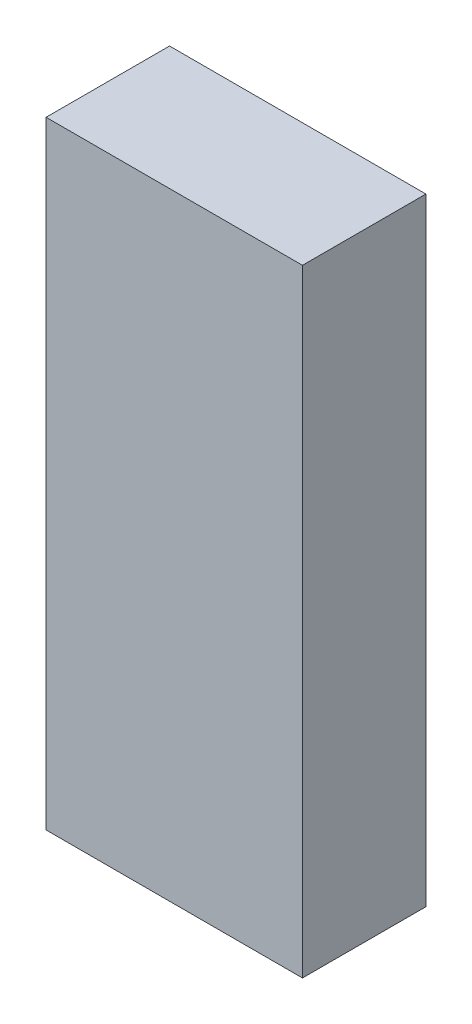
ISO-10303-21;
HEADER;
FILE_DESCRIPTION(('STEP AP214'),'2;1');
FILE_NAME('part.step','',(''),(''),'','','');
FILE_SCHEMA(('AUTOMOTIVE_DESIGN { 1 0 10303 214 1 1 1 1 }'));
ENDSEC;
DATA;
#1=APPLICATION_CONTEXT('core data for automotive mechanical design processes');
#2=APPLICATION_PROTOCOL_DEFINITION('international standard','automotive_design',2000,#1);
#3=PRODUCT_CONTEXT('',#1,'mechanical');
#4=PRODUCT('Part','Part','',(#3));
#5=PRODUCT_RELATED_PRODUCT_CATEGORY('part','',(#4));
#6=PRODUCT_DEFINITION_FORMATION('','',#4);
#7=PRODUCT_DEFINITION_CONTEXT('part definition',#1,'design');
#8=PRODUCT_DEFINITION('design','',#6,#7);
#9=PRODUCT_DEFINITION_SHAPE('','',#8);
#10=(LENGTH_UNIT() NAMED_UNIT(*) SI_UNIT(.MILLI.,.METRE.));
#11=(NAMED_UNIT(*) PLANE_ANGLE_UNIT() SI_UNIT($,.RADIAN.));
#12=(NAMED_UNIT(*) SI_UNIT($,.STERADIAN.) SOLID_ANGLE_UNIT());
#13=UNCERTAINTY_MEASURE_WITH_UNIT(LENGTH_MEASURE(1.E-05),#10,'distance_accuracy_value','');
#14=(GEOMETRIC_REPRESENTATION_CONTEXT(3) GLOBAL_UNCERTAINTY_ASSIGNED_CONTEXT((#13)) GLOBAL_UNIT_ASSIGNED_CONTEXT((#10,
#11,#12)) REPRESENTATION_CONTEXT('',''));
#15=CARTESIAN_POINT('',(0.,0.,0.));
#16=DIRECTION('',(0.,0.,1.));
#17=DIRECTION('',(1.,0.,0.));
#18=AXIS2_PLACEMENT_3D('',#15,#16,#17);
#19=CARTESIAN_POINT('',(0.,0.,13.));
#20=DIRECTION('',(-1.,0.,0.));
#21=DIRECTION('',(0.,0.,1.));
#22=AXIS2_PLACEMENT_3D('',#19,#20,#21);
#23=PLANE('',#22);
#24=DIRECTION('',(0.,1.,0.));
#25=VECTOR('',#24,1.);
#26=CARTESIAN_POINT('',(0.,0.,0.));
#27=LINE('',#26,#25);
#28=CARTESIAN_POINT('',(0.,0.,0.));
#29=VERTEX_POINT('',#28);
#30=CARTESIAN_POINT('',(0.,65.,0.));
#31=VERTEX_POINT('',#30);
#32=EDGE_CURVE('E100',#29,#31,#27,.T.);
#33=ORIENTED_EDGE('',*,*,#32,.T.);
#34=DIRECTION('',(0.,0.,-1.));
#35=VECTOR('',#34,1.);
#36=CARTESIAN_POINT('',(0.,65.,13.));
#37=LINE('',#36,#35);
#38=CARTESIAN_POINT('',(0.,65.,13.));
#39=VERTEX_POINT('',#38);
#40=EDGE_CURVE('E11',#39,#31,#37,.T.);
#41=ORIENTED_EDGE('',*,*,#40,.F.);
#42=DIRECTION('',(0.,1.,0.));
#43=VECTOR('',#42,1.);
#44=CARTESIAN_POINT('',(0.,0.,13.));
#45=LINE('',#44,#43);
#46=CARTESIAN_POINT('',(0.,0.,13.));
#47=VERTEX_POINT('',#46);
#48=EDGE_CURVE('E88',#47,#39,#45,.T.);
#49=ORIENTED_EDGE('',*,*,#48,.F.);
#50=DIRECTION('',(0.,0.,-1.));
#51=VECTOR('',#50,1.);
#52=CARTESIAN_POINT('',(0.,0.,13.));
#53=LINE('',#52,#51);
#54=EDGE_CURVE('E96',#47,#29,#53,.T.);
#55=ORIENTED_EDGE('',*,*,#54,.T.);
#56=EDGE_LOOP('',(#33,#41,#49,#55));
#57=FACE_BOUND('',#56,.T.);
#58=ADVANCED_FACE('F37',(#57),#23,.F.);
#59=CARTESIAN_POINT('',(0.,65.,13.));
#60=DIRECTION('',(0.,-1.,0.));
#61=DIRECTION('',(0.,0.,-1.));
#62=AXIS2_PLACEMENT_3D('',#59,#60,#61);
#63=PLANE('',#62);
#64=DIRECTION('',(-1.,0.,0.));
#65=VECTOR('',#64,1.);
#66=CARTESIAN_POINT('',(0.,65.,0.));
#67=LINE('',#66,#65);
#68=CARTESIAN_POINT('',(-27.,65.,0.));
#69=VERTEX_POINT('',#68);
#70=EDGE_CURVE('E92',#31,#69,#67,.T.);
#71=ORIENTED_EDGE('',*,*,#70,.T.);
#72=DIRECTION('',(0.,0.,-1.));
#73=VECTOR('',#72,1.);
#74=CARTESIAN_POINT('',(-27.,65.,13.));
#75=LINE('',#74,#73);
#76=CARTESIAN_POINT('',(-27.,65.,13.));
#77=VERTEX_POINT('',#76);
#78=EDGE_CURVE('E45',#77,#69,#75,.T.);
#79=ORIENTED_EDGE('',*,*,#78,.F.);
#80=DIRECTION('',(-1.,0.,0.));
#81=VECTOR('',#80,1.);
#82=CARTESIAN_POINT('',(0.,65.,13.));
#83=LINE('',#82,#81);
#84=EDGE_CURVE('E83',#39,#77,#83,.T.);
#85=ORIENTED_EDGE('',*,*,#84,.F.);
#86=ORIENTED_EDGE('',*,*,#40,.T.);
#87=EDGE_LOOP('',(#71,#79,#85,#86));
#88=FACE_BOUND('',#87,.T.);
#89=ADVANCED_FACE('F91',(#88),#63,.F.);
#90=CARTESIAN_POINT('',(-27.,0.,13.));
#91=DIRECTION('',(1.,0.,0.));
#92=DIRECTION('',(0.,0.,-1.));
#93=AXIS2_PLACEMENT_3D('',#90,#91,#92);
#94=PLANE('',#93);
#95=DIRECTION('',(0.,-1.,0.));
#96=VECTOR('',#95,1.);
#97=CARTESIAN_POINT('',(-27.,0.,0.));
#98=LINE('',#97,#96);
#99=CARTESIAN_POINT('',(-27.,0.,0.));
#100=VERTEX_POINT('',#99);
#101=EDGE_CURVE('E70',#69,#100,#98,.T.);
#102=ORIENTED_EDGE('',*,*,#101,.T.);
#103=DIRECTION('',(0.,0.,-1.));
#104=VECTOR('',#103,1.);
#105=CARTESIAN_POINT('',(-27.,0.,13.));
#106=LINE('',#105,#104);
#107=CARTESIAN_POINT('',(-27.,0.,13.));
#108=VERTEX_POINT('',#107);
#109=EDGE_CURVE('E93',#108,#100,#106,.T.);
#110=ORIENTED_EDGE('',*,*,#109,.F.);
#111=DIRECTION('',(0.,-1.,0.));
#112=VECTOR('',#111,1.);
#113=CARTESIAN_POINT('',(-27.,0.,13.));
#114=LINE('',#113,#112);
#115=EDGE_CURVE('E86',#77,#108,#114,.T.);
#116=ORIENTED_EDGE('',*,*,#115,.F.);
#117=ORIENTED_EDGE('',*,*,#78,.T.);
#118=EDGE_LOOP('',(#102,#110,#116,#117));
#119=FACE_BOUND('',#118,.T.);
#120=ADVANCED_FACE('F94',(#119),#94,.F.);
#121=CARTESIAN_POINT('',(0.,0.,13.));
#122=DIRECTION('',(0.,1.,0.));
#123=DIRECTION('',(0.,0.,1.));
#124=AXIS2_PLACEMENT_3D('',#121,#122,#123);
#125=PLANE('',#124);
#126=DIRECTION('',(1.,0.,0.));
#127=VECTOR('',#126,1.);
#128=CARTESIAN_POINT('',(0.,0.,0.));
#129=LINE('',#128,#127);
#130=EDGE_CURVE('E76',#100,#29,#129,.T.);
#131=ORIENTED_EDGE('',*,*,#130,.T.);
#132=ORIENTED_EDGE('',*,*,#54,.F.);
#133=DIRECTION('',(1.,0.,0.));
#134=VECTOR('',#133,1.);
#135=CARTESIAN_POINT('',(0.,0.,13.));
#136=LINE('',#135,#134);
#137=EDGE_CURVE('E53',#108,#47,#136,.T.);
#138=ORIENTED_EDGE('',*,*,#137,.F.);
#139=ORIENTED_EDGE('',*,*,#109,.T.);
#140=EDGE_LOOP('',(#131,#132,#138,#139));
#141=FACE_BOUND('',#140,.T.);
#142=ADVANCED_FACE('F107',(#141),#125,.F.);
#143=CARTESIAN_POINT('',(0.,0.,13.));
#144=DIRECTION('',(0.,0.,1.));
#145=DIRECTION('',(1.,0.,0.));
#146=AXIS2_PLACEMENT_3D('',#143,#144,#145);
#147=PLANE('',#146);
#148=ORIENTED_EDGE('',*,*,#48,.T.);
#149=ORIENTED_EDGE('',*,*,#84,.T.);
#150=ORIENTED_EDGE('',*,*,#115,.T.);
#151=ORIENTED_EDGE('',*,*,#137,.T.);
#152=EDGE_LOOP('',(#148,#149,#150,#151));
#153=FACE_BOUND('',#152,.T.);
#154=ADVANCED_FACE('F84',(#153),#147,.T.);
#155=CARTESIAN_POINT('',(0.,0.,0.));
#156=DIRECTION('',(0.,0.,1.));
#157=DIRECTION('',(1.,0.,0.));
#158=AXIS2_PLACEMENT_3D('',#155,#156,#157);
#159=PLANE('',#158);
#160=ORIENTED_EDGE('',*,*,#32,.F.);
#161=ORIENTED_EDGE('',*,*,#130,.F.);
#162=ORIENTED_EDGE('',*,*,#101,.F.);
#163=ORIENTED_EDGE('',*,*,#70,.F.);
#164=EDGE_LOOP('',(#160,#161,#162,#163));
#165=FACE_BOUND('',#164,.T.);
#166=ADVANCED_FACE('F110',(#165),#159,.F.);
#167=CLOSED_SHELL('',(#58,#89,#120,#142,#154,#166));
#168=MANIFOLD_SOLID_BREP('B2',#167);
#169=ADVANCED_BREP_SHAPE_REPRESENTATION('',(#18,#168),#14);
#170=SHAPE_DEFINITION_REPRESENTATION(#9,#169);
ENDSEC;
END-ISO-10303-21;
